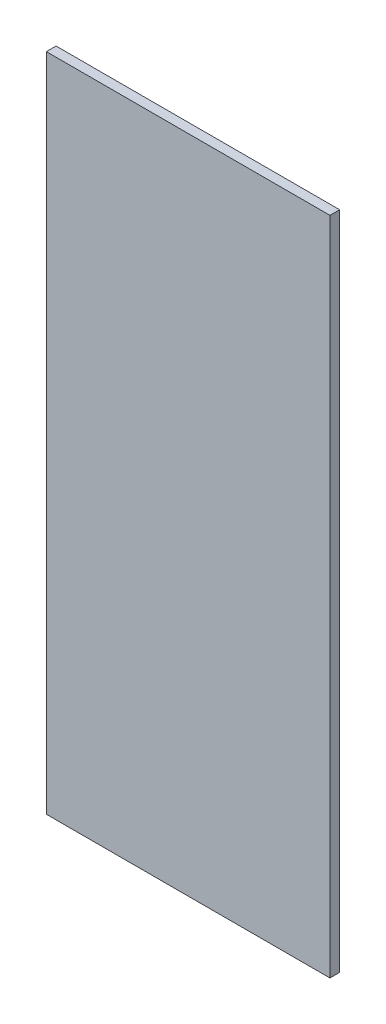
ISO-10303-21;
HEADER;
FILE_DESCRIPTION(('STEP AP214'),'2;1');
FILE_NAME('part.step','',(''),(''),'','','');
FILE_SCHEMA(('AUTOMOTIVE_DESIGN { 1 0 10303 214 1 1 1 1 }'));
ENDSEC;
DATA;
#1=APPLICATION_CONTEXT('core data for automotive mechanical design processes');
#2=APPLICATION_PROTOCOL_DEFINITION('international standard','automotive_design',2000,#1);
#3=PRODUCT_CONTEXT('',#1,'mechanical');
#4=PRODUCT('Part','Part','',(#3));
#5=PRODUCT_RELATED_PRODUCT_CATEGORY('part','',(#4));
#6=PRODUCT_DEFINITION_FORMATION('','',#4);
#7=PRODUCT_DEFINITION_CONTEXT('part definition',#1,'design');
#8=PRODUCT_DEFINITION('design','',#6,#7);
#9=PRODUCT_DEFINITION_SHAPE('','',#8);
#10=(LENGTH_UNIT() NAMED_UNIT(*) SI_UNIT(.MILLI.,.METRE.));
#11=(NAMED_UNIT(*) PLANE_ANGLE_UNIT() SI_UNIT($,.RADIAN.));
#12=(NAMED_UNIT(*) SI_UNIT($,.STERADIAN.) SOLID_ANGLE_UNIT());
#13=UNCERTAINTY_MEASURE_WITH_UNIT(LENGTH_MEASURE(1.E-05),#10,'distance_accuracy_value','');
#14=(GEOMETRIC_REPRESENTATION_CONTEXT(3) GLOBAL_UNCERTAINTY_ASSIGNED_CONTEXT((#13)) GLOBAL_UNIT_ASSIGNED_CONTEXT((#10,
#11,#12)) REPRESENTATION_CONTEXT('',''));
#15=CARTESIAN_POINT('',(0.,0.,0.));
#16=DIRECTION('',(0.,0.,1.));
#17=DIRECTION('',(1.,0.,0.));
#18=AXIS2_PLACEMENT_3D('',#15,#16,#17);
#19=CARTESIAN_POINT('',(73.,-170.,2.5));
#20=DIRECTION('',(-1.,0.,0.));
#21=DIRECTION('',(0.,0.,1.));
#22=AXIS2_PLACEMENT_3D('',#19,#20,#21);
#23=PLANE('',#22);
#24=DIRECTION('',(0.,1.,0.));
#25=VECTOR('',#24,1.);
#26=CARTESIAN_POINT('',(73.,-170.,-2.5));
#27=LINE('',#26,#25);
#28=CARTESIAN_POINT('',(73.,-170.,-2.5));
#29=VERTEX_POINT('',#28);
#30=CARTESIAN_POINT('',(73.,170.,-2.5));
#31=VERTEX_POINT('',#30);
#32=EDGE_CURVE('E96',#29,#31,#27,.T.);
#33=ORIENTED_EDGE('',*,*,#32,.T.);
#34=DIRECTION('',(0.,0.,-1.));
#35=VECTOR('',#34,1.);
#36=CARTESIAN_POINT('',(73.,170.,2.5));
#37=LINE('',#36,#35);
#38=CARTESIAN_POINT('',(73.,170.,2.5));
#39=VERTEX_POINT('',#38);
#40=EDGE_CURVE('E11',#39,#31,#37,.T.);
#41=ORIENTED_EDGE('',*,*,#40,.F.);
#42=DIRECTION('',(0.,1.,0.));
#43=VECTOR('',#42,1.);
#44=CARTESIAN_POINT('',(73.,-170.,2.5));
#45=LINE('',#44,#43);
#46=CARTESIAN_POINT('',(73.,-170.,2.5));
#47=VERTEX_POINT('',#46);
#48=EDGE_CURVE('E84',#47,#39,#45,.T.);
#49=ORIENTED_EDGE('',*,*,#48,.F.);
#50=DIRECTION('',(0.,0.,-1.));
#51=VECTOR('',#50,1.);
#52=CARTESIAN_POINT('',(73.,-170.,2.5));
#53=LINE('',#52,#51);
#54=EDGE_CURVE('E92',#47,#29,#53,.T.);
#55=ORIENTED_EDGE('',*,*,#54,.T.);
#56=EDGE_LOOP('',(#33,#41,#49,#55));
#57=FACE_BOUND('',#56,.T.);
#58=ADVANCED_FACE('F33',(#57),#23,.F.);
#59=CARTESIAN_POINT('',(-73.,170.,2.5));
#60=DIRECTION('',(0.,-1.,0.));
#61=DIRECTION('',(0.,0.,-1.));
#62=AXIS2_PLACEMENT_3D('',#59,#60,#61);
#63=PLANE('',#62);
#64=DIRECTION('',(-1.,0.,0.));
#65=VECTOR('',#64,1.);
#66=CARTESIAN_POINT('',(-73.,170.,-2.5));
#67=LINE('',#66,#65);
#68=CARTESIAN_POINT('',(-73.,170.,-2.5));
#69=VERTEX_POINT('',#68);
#70=EDGE_CURVE('E88',#31,#69,#67,.T.);
#71=ORIENTED_EDGE('',*,*,#70,.T.);
#72=DIRECTION('',(0.,0.,-1.));
#73=VECTOR('',#72,1.);
#74=CARTESIAN_POINT('',(-73.,170.,2.5));
#75=LINE('',#74,#73);
#76=CARTESIAN_POINT('',(-73.,170.,2.5));
#77=VERTEX_POINT('',#76);
#78=EDGE_CURVE('E41',#77,#69,#75,.T.);
#79=ORIENTED_EDGE('',*,*,#78,.F.);
#80=DIRECTION('',(-1.,0.,0.));
#81=VECTOR('',#80,1.);
#82=CARTESIAN_POINT('',(-73.,170.,2.5));
#83=LINE('',#82,#81);
#84=EDGE_CURVE('E79',#39,#77,#83,.T.);
#85=ORIENTED_EDGE('',*,*,#84,.F.);
#86=ORIENTED_EDGE('',*,*,#40,.T.);
#87=EDGE_LOOP('',(#71,#79,#85,#86));
#88=FACE_BOUND('',#87,.T.);
#89=ADVANCED_FACE('F87',(#88),#63,.F.);
#90=CARTESIAN_POINT('',(-73.,-170.,2.5));
#91=DIRECTION('',(1.,0.,0.));
#92=DIRECTION('',(0.,0.,-1.));
#93=AXIS2_PLACEMENT_3D('',#90,#91,#92);
#94=PLANE('',#93);
#95=DIRECTION('',(0.,-1.,0.));
#96=VECTOR('',#95,1.);
#97=CARTESIAN_POINT('',(-73.,-170.,-2.5));
#98=LINE('',#97,#96);
#99=CARTESIAN_POINT('',(-73.,-170.,-2.5));
#100=VERTEX_POINT('',#99);
#101=EDGE_CURVE('E66',#69,#100,#98,.T.);
#102=ORIENTED_EDGE('',*,*,#101,.T.);
#103=DIRECTION('',(0.,0.,-1.));
#104=VECTOR('',#103,1.);
#105=CARTESIAN_POINT('',(-73.,-170.,2.5));
#106=LINE('',#105,#104);
#107=CARTESIAN_POINT('',(-73.,-170.,2.5));
#108=VERTEX_POINT('',#107);
#109=EDGE_CURVE('E89',#108,#100,#106,.T.);
#110=ORIENTED_EDGE('',*,*,#109,.F.);
#111=DIRECTION('',(0.,-1.,0.));
#112=VECTOR('',#111,1.);
#113=CARTESIAN_POINT('',(-73.,-170.,2.5));
#114=LINE('',#113,#112);
#115=EDGE_CURVE('E82',#77,#108,#114,.T.);
#116=ORIENTED_EDGE('',*,*,#115,.F.);
#117=ORIENTED_EDGE('',*,*,#78,.T.);
#118=EDGE_LOOP('',(#102,#110,#116,#117));
#119=FACE_BOUND('',#118,.T.);
#120=ADVANCED_FACE('F90',(#119),#94,.F.);
#121=CARTESIAN_POINT('',(-73.,-170.,2.5));
#122=DIRECTION('',(0.,1.,0.));
#123=DIRECTION('',(0.,0.,1.));
#124=AXIS2_PLACEMENT_3D('',#121,#122,#123);
#125=PLANE('',#124);
#126=DIRECTION('',(1.,0.,0.));
#127=VECTOR('',#126,1.);
#128=CARTESIAN_POINT('',(-73.,-170.,-2.5));
#129=LINE('',#128,#127);
#130=EDGE_CURVE('E72',#100,#29,#129,.T.);
#131=ORIENTED_EDGE('',*,*,#130,.T.);
#132=ORIENTED_EDGE('',*,*,#54,.F.);
#133=DIRECTION('',(1.,0.,0.));
#134=VECTOR('',#133,1.);
#135=CARTESIAN_POINT('',(-73.,-170.,2.5));
#136=LINE('',#135,#134);
#137=EDGE_CURVE('E49',#108,#47,#136,.T.);
#138=ORIENTED_EDGE('',*,*,#137,.F.);
#139=ORIENTED_EDGE('',*,*,#109,.T.);
#140=EDGE_LOOP('',(#131,#132,#138,#139));
#141=FACE_BOUND('',#140,.T.);
#142=ADVANCED_FACE('F103',(#141),#125,.F.);
#143=CARTESIAN_POINT('',(0.,0.,2.5));
#144=DIRECTION('',(0.,0.,-1.));
#145=DIRECTION('',(-1.,0.,0.));
#146=AXIS2_PLACEMENT_3D('',#143,#144,#145);
#147=PLANE('',#146);
#148=ORIENTED_EDGE('',*,*,#48,.T.);
#149=ORIENTED_EDGE('',*,*,#84,.T.);
#150=ORIENTED_EDGE('',*,*,#115,.T.);
#151=ORIENTED_EDGE('',*,*,#137,.T.);
#152=EDGE_LOOP('',(#148,#149,#150,#151));
#153=FACE_BOUND('',#152,.T.);
#154=ADVANCED_FACE('F80',(#153),#147,.F.);
#155=CARTESIAN_POINT('',(0.,0.,-2.5));
#156=DIRECTION('',(0.,0.,-1.));
#157=DIRECTION('',(-1.,0.,0.));
#158=AXIS2_PLACEMENT_3D('',#155,#156,#157);
#159=PLANE('',#158);
#160=ORIENTED_EDGE('',*,*,#32,.F.);
#161=ORIENTED_EDGE('',*,*,#130,.F.);
#162=ORIENTED_EDGE('',*,*,#101,.F.);
#163=ORIENTED_EDGE('',*,*,#70,.F.);
#164=EDGE_LOOP('',(#160,#161,#162,#163));
#165=FACE_BOUND('',#164,.T.);
#166=ADVANCED_FACE('F106',(#165),#159,.T.);
#167=CLOSED_SHELL('',(#58,#89,#120,#142,#154,#166));
#168=MANIFOLD_SOLID_BREP('B2',#167);
#169=ADVANCED_BREP_SHAPE_REPRESENTATION('',(#18,#168),#14);
#170=SHAPE_DEFINITION_REPRESENTATION(#9,#169);
ENDSEC;
END-ISO-10303-21;
